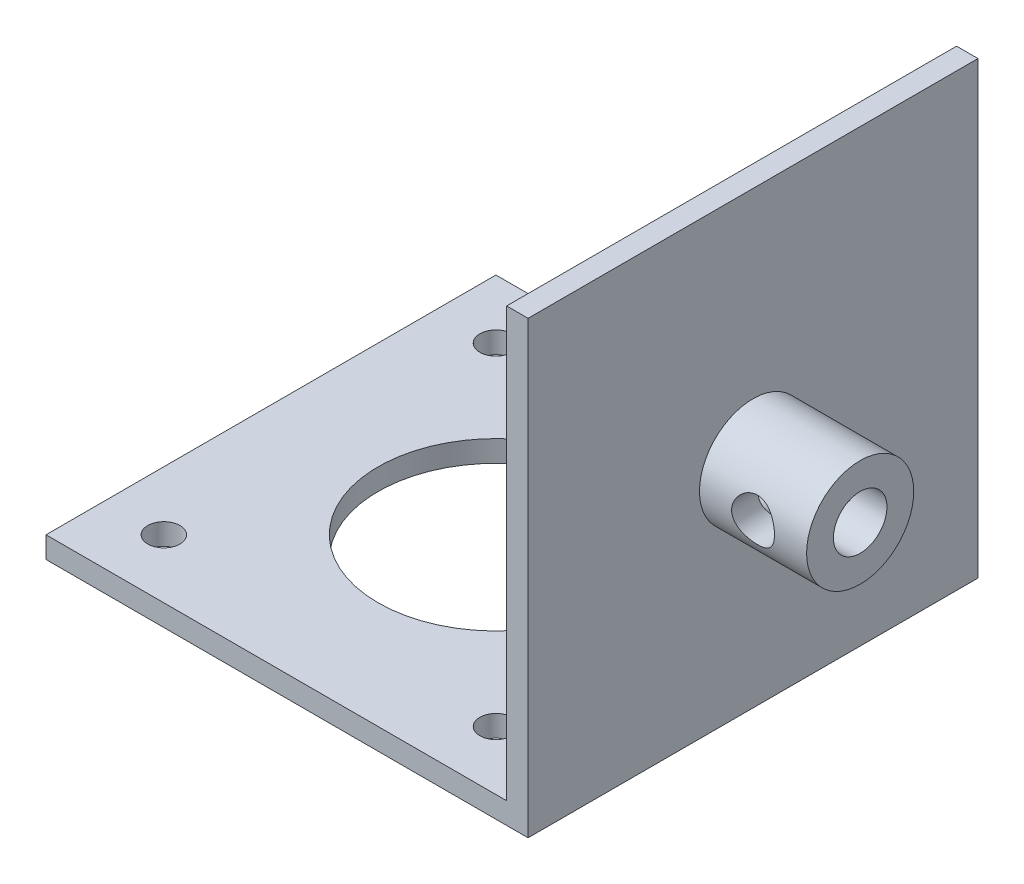
ISO-10303-21;
HEADER;
FILE_DESCRIPTION(('STEP AP214'),'2;1');
FILE_NAME('part.step','',(''),(''),'','','');
FILE_SCHEMA(('AUTOMOTIVE_DESIGN { 1 0 10303 214 1 1 1 1 }'));
ENDSEC;
DATA;
#1=APPLICATION_CONTEXT('core data for automotive mechanical design processes');
#2=APPLICATION_PROTOCOL_DEFINITION('international standard','automotive_design',2000,#1);
#3=PRODUCT_CONTEXT('',#1,'mechanical');
#4=PRODUCT('Part','Part','',(#3));
#5=PRODUCT_RELATED_PRODUCT_CATEGORY('part','',(#4));
#6=PRODUCT_DEFINITION_FORMATION('','',#4);
#7=PRODUCT_DEFINITION_CONTEXT('part definition',#1,'design');
#8=PRODUCT_DEFINITION('design','',#6,#7);
#9=PRODUCT_DEFINITION_SHAPE('','',#8);
#10=(LENGTH_UNIT() NAMED_UNIT(*) SI_UNIT(.MILLI.,.METRE.));
#11=(NAMED_UNIT(*) PLANE_ANGLE_UNIT() SI_UNIT($,.RADIAN.));
#12=(NAMED_UNIT(*) SI_UNIT($,.STERADIAN.) SOLID_ANGLE_UNIT());
#13=UNCERTAINTY_MEASURE_WITH_UNIT(LENGTH_MEASURE(1.E-05),#10,'distance_accuracy_value','');
#14=(GEOMETRIC_REPRESENTATION_CONTEXT(3) GLOBAL_UNCERTAINTY_ASSIGNED_CONTEXT((#13)) GLOBAL_UNIT_ASSIGNED_CONTEXT((#10,
#11,#12)) REPRESENTATION_CONTEXT('',''));
#15=CARTESIAN_POINT('',(0.,0.,0.));
#16=DIRECTION('',(0.,0.,1.));
#17=DIRECTION('',(1.,0.,0.));
#18=AXIS2_PLACEMENT_3D('',#15,#16,#17);
#19=CARTESIAN_POINT('',(0.,2.,0.));
#20=DIRECTION('',(0.,-1.,0.));
#21=DIRECTION('',(0.,0.,-1.));
#22=AXIS2_PLACEMENT_3D('',#19,#20,#21);
#23=PLANE('',#22);
#24=CARTESIAN_POINT('',(5.50000000000001,2.,-36.5));
#25=DIRECTION('',(0.,1.,0.));
#26=DIRECTION('',(0.,0.,1.));
#27=AXIS2_PLACEMENT_3D('',#24,#25,#26);
#28=CIRCLE('',#27,1.5);
#29=CARTESIAN_POINT('',(5.50000000000001,2.,-35.));
#30=VERTEX_POINT('',#29);
#31=EDGE_CURVE('E120',#30,#30,#28,.T.);
#32=ORIENTED_EDGE('',*,*,#31,.F.);
#33=EDGE_LOOP('',(#32));
#34=FACE_BOUND('',#33,.T.);
#35=CARTESIAN_POINT('',(21.,2.,-21.));
#36=DIRECTION('',(0.,1.,0.));
#37=DIRECTION('',(0.,0.,1.));
#38=AXIS2_PLACEMENT_3D('',#35,#36,#37);
#39=CIRCLE('',#38,11.);
#40=CARTESIAN_POINT('',(21.,2.,-10.));
#41=VERTEX_POINT('',#40);
#42=EDGE_CURVE('E257',#41,#41,#39,.T.);
#43=ORIENTED_EDGE('',*,*,#42,.F.);
#44=EDGE_LOOP('',(#43));
#45=FACE_BOUND('',#44,.T.);
#46=CARTESIAN_POINT('',(5.50000000000001,2.,-5.5));
#47=DIRECTION('',(0.,1.,0.));
#48=DIRECTION('',(0.,0.,1.));
#49=AXIS2_PLACEMENT_3D('',#46,#47,#48);
#50=CIRCLE('',#49,1.5);
#51=CARTESIAN_POINT('',(5.50000000000001,2.,-4.));
#52=VERTEX_POINT('',#51);
#53=EDGE_CURVE('E265',#52,#52,#50,.T.);
#54=ORIENTED_EDGE('',*,*,#53,.F.);
#55=EDGE_LOOP('',(#54));
#56=FACE_BOUND('',#55,.T.);
#57=CARTESIAN_POINT('',(36.5,2.,-5.5));
#58=DIRECTION('',(0.,1.,0.));
#59=DIRECTION('',(0.,0.,1.));
#60=AXIS2_PLACEMENT_3D('',#57,#58,#59);
#61=CIRCLE('',#60,1.5);
#62=CARTESIAN_POINT('',(36.5,2.,-4.));
#63=VERTEX_POINT('',#62);
#64=EDGE_CURVE('E273',#63,#63,#61,.T.);
#65=ORIENTED_EDGE('',*,*,#64,.F.);
#66=EDGE_LOOP('',(#65));
#67=FACE_BOUND('',#66,.T.);
#68=CARTESIAN_POINT('',(36.5,2.,-36.5));
#69=DIRECTION('',(0.,1.,0.));
#70=DIRECTION('',(0.,0.,1.));
#71=AXIS2_PLACEMENT_3D('',#68,#69,#70);
#72=CIRCLE('',#71,1.5);
#73=CARTESIAN_POINT('',(36.5,2.,-35.));
#74=VERTEX_POINT('',#73);
#75=EDGE_CURVE('E281',#74,#74,#72,.T.);
#76=ORIENTED_EDGE('',*,*,#75,.F.);
#77=EDGE_LOOP('',(#76));
#78=FACE_BOUND('',#77,.T.);
#79=DIRECTION('',(0.,0.,1.));
#80=VECTOR('',#79,1.);
#81=CARTESIAN_POINT('',(43.,2.,-42.));
#82=LINE('',#81,#80);
#83=CARTESIAN_POINT('',(43.,2.,-42.));
#84=VERTEX_POINT('',#83);
#85=CARTESIAN_POINT('',(43.,2.,0.));
#86=VERTEX_POINT('',#85);
#87=EDGE_CURVE('E64',#84,#86,#82,.T.);
#88=ORIENTED_EDGE('',*,*,#87,.F.);
#89=DIRECTION('',(-1.,0.,0.));
#90=VECTOR('',#89,1.);
#91=CARTESIAN_POINT('',(0.,2.,-42.));
#92=LINE('',#91,#90);
#93=CARTESIAN_POINT('',(0.,2.,-42.));
#94=VERTEX_POINT('',#93);
#95=EDGE_CURVE('E69',#84,#94,#92,.T.);
#96=ORIENTED_EDGE('',*,*,#95,.T.);
#97=DIRECTION('',(0.,0.,1.));
#98=VECTOR('',#97,1.);
#99=CARTESIAN_POINT('',(0.,2.,0.));
#100=LINE('',#99,#98);
#101=CARTESIAN_POINT('',(0.,2.,0.));
#102=VERTEX_POINT('',#101);
#103=EDGE_CURVE('E101',#94,#102,#100,.T.);
#104=ORIENTED_EDGE('',*,*,#103,.T.);
#105=DIRECTION('',(1.,0.,0.));
#106=VECTOR('',#105,1.);
#107=CARTESIAN_POINT('',(0.,2.,0.));
#108=LINE('',#107,#106);
#109=EDGE_CURVE('E292',#102,#86,#108,.T.);
#110=ORIENTED_EDGE('',*,*,#109,.T.);
#111=EDGE_LOOP('',(#88,#96,#104,#110));
#112=FACE_BOUND('',#111,.T.);
#113=ADVANCED_FACE('F41',(#34,#45,#56,#67,#78,#112),#23,.F.);
#114=CARTESIAN_POINT('',(0.,2.,0.));
#115=DIRECTION('',(1.,0.,0.));
#116=DIRECTION('',(0.,0.,-1.));
#117=AXIS2_PLACEMENT_3D('',#114,#115,#116);
#118=PLANE('',#117);
#119=DIRECTION('',(0.,0.,1.));
#120=VECTOR('',#119,1.);
#121=CARTESIAN_POINT('',(0.,0.,0.));
#122=LINE('',#121,#120);
#123=CARTESIAN_POINT('',(0.,0.,-42.));
#124=VERTEX_POINT('',#123);
#125=CARTESIAN_POINT('',(0.,0.,0.));
#126=VERTEX_POINT('',#125);
#127=EDGE_CURVE('E107',#124,#126,#122,.T.);
#128=ORIENTED_EDGE('',*,*,#127,.T.);
#129=DIRECTION('',(0.,-1.,0.));
#130=VECTOR('',#129,1.);
#131=CARTESIAN_POINT('',(0.,2.,0.));
#132=LINE('',#131,#130);
#133=EDGE_CURVE('E56',#102,#126,#132,.T.);
#134=ORIENTED_EDGE('',*,*,#133,.F.);
#135=ORIENTED_EDGE('',*,*,#103,.F.);
#136=DIRECTION('',(0.,-1.,0.));
#137=VECTOR('',#136,1.);
#138=CARTESIAN_POINT('',(0.,2.,-42.));
#139=LINE('',#138,#137);
#140=EDGE_CURVE('E92',#94,#124,#139,.T.);
#141=ORIENTED_EDGE('',*,*,#140,.T.);
#142=EDGE_LOOP('',(#128,#134,#135,#141));
#143=FACE_BOUND('',#142,.T.);
#144=ADVANCED_FACE('F43',(#143),#118,.F.);
#145=CARTESIAN_POINT('',(0.,2.,0.));
#146=DIRECTION('',(0.,0.,-1.));
#147=DIRECTION('',(-1.,0.,0.));
#148=AXIS2_PLACEMENT_3D('',#145,#146,#147);
#149=PLANE('',#148);
#150=DIRECTION('',(1.,0.,0.));
#151=VECTOR('',#150,1.);
#152=CARTESIAN_POINT('',(0.,0.,0.));
#153=LINE('',#152,#151);
#154=CARTESIAN_POINT('',(45.,0.,0.));
#155=VERTEX_POINT('',#154);
#156=EDGE_CURVE('E111',#126,#155,#153,.T.);
#157=ORIENTED_EDGE('',*,*,#156,.T.);
#158=DIRECTION('',(0.,-1.,0.));
#159=VECTOR('',#158,1.);
#160=CARTESIAN_POINT('',(45.,2.,0.));
#161=LINE('',#160,#159);
#162=CARTESIAN_POINT('',(45.,42.,0.));
#163=VERTEX_POINT('',#162);
#164=EDGE_CURVE('E129',#163,#155,#161,.T.);
#165=ORIENTED_EDGE('',*,*,#164,.F.);
#166=DIRECTION('',(1.,0.,0.));
#167=VECTOR('',#166,1.);
#168=CARTESIAN_POINT('',(43.,42.,0.));
#169=LINE('',#168,#167);
#170=CARTESIAN_POINT('',(43.,42.,0.));
#171=VERTEX_POINT('',#170);
#172=EDGE_CURVE('E245',#171,#163,#169,.T.);
#173=ORIENTED_EDGE('',*,*,#172,.F.);
#174=DIRECTION('',(0.,-1.,0.));
#175=VECTOR('',#174,1.);
#176=CARTESIAN_POINT('',(43.,42.,0.));
#177=LINE('',#176,#175);
#178=EDGE_CURVE('E247',#171,#86,#177,.T.);
#179=ORIENTED_EDGE('',*,*,#178,.T.);
#180=ORIENTED_EDGE('',*,*,#109,.F.);
#181=ORIENTED_EDGE('',*,*,#133,.T.);
#182=EDGE_LOOP('',(#157,#165,#173,#179,#180,#181));
#183=FACE_BOUND('',#182,.T.);
#184=ADVANCED_FACE('F210',(#183),#149,.F.);
#185=CARTESIAN_POINT('',(45.,2.,0.));
#186=DIRECTION('',(-1.,0.,0.));
#187=DIRECTION('',(0.,0.,1.));
#188=AXIS2_PLACEMENT_3D('',#185,#186,#187);
#189=PLANE('',#188);
#190=CARTESIAN_POINT('',(45.,20.,-21.));
#191=DIRECTION('',(-1.,0.,0.));
#192=DIRECTION('',(0.,0.,1.));
#193=AXIS2_PLACEMENT_3D('',#190,#191,#192);
#194=CIRCLE('',#193,5.);
#195=CARTESIAN_POINT('',(45.,20.,-16.));
#196=VERTEX_POINT('',#195);
#197=EDGE_CURVE('E11',#196,#196,#194,.F.);
#198=ORIENTED_EDGE('',*,*,#197,.F.);
#199=EDGE_LOOP('',(#198));
#200=FACE_BOUND('',#199,.T.);
#201=DIRECTION('',(0.,0.,-1.));
#202=VECTOR('',#201,1.);
#203=CARTESIAN_POINT('',(45.,0.,0.));
#204=LINE('',#203,#202);
#205=CARTESIAN_POINT('',(45.,0.,-42.));
#206=VERTEX_POINT('',#205);
#207=EDGE_CURVE('E102',#155,#206,#204,.T.);
#208=ORIENTED_EDGE('',*,*,#207,.T.);
#209=DIRECTION('',(0.,-1.,0.));
#210=VECTOR('',#209,1.);
#211=CARTESIAN_POINT('',(45.,2.,-42.));
#212=LINE('',#211,#210);
#213=CARTESIAN_POINT('',(45.,42.,-42.));
#214=VERTEX_POINT('',#213);
#215=EDGE_CURVE('E96',#214,#206,#212,.T.);
#216=ORIENTED_EDGE('',*,*,#215,.F.);
#217=DIRECTION('',(0.,0.,-1.));
#218=VECTOR('',#217,1.);
#219=CARTESIAN_POINT('',(45.,42.,0.));
#220=LINE('',#219,#218);
#221=EDGE_CURVE('E224',#163,#214,#220,.T.);
#222=ORIENTED_EDGE('',*,*,#221,.F.);
#223=ORIENTED_EDGE('',*,*,#164,.T.);
#224=EDGE_LOOP('',(#208,#216,#222,#223));
#225=FACE_BOUND('',#224,.T.);
#226=ADVANCED_FACE('F208',(#200,#225),#189,.F.);
#227=CARTESIAN_POINT('',(0.,2.,-42.));
#228=DIRECTION('',(0.,0.,1.));
#229=DIRECTION('',(1.,0.,0.));
#230=AXIS2_PLACEMENT_3D('',#227,#228,#229);
#231=PLANE('',#230);
#232=DIRECTION('',(-1.,0.,0.));
#233=VECTOR('',#232,1.);
#234=CARTESIAN_POINT('',(0.,0.,-42.));
#235=LINE('',#234,#233);
#236=EDGE_CURVE('E89',#206,#124,#235,.T.);
#237=ORIENTED_EDGE('',*,*,#236,.T.);
#238=ORIENTED_EDGE('',*,*,#140,.F.);
#239=ORIENTED_EDGE('',*,*,#95,.F.);
#240=DIRECTION('',(0.,-1.,0.));
#241=VECTOR('',#240,1.);
#242=CARTESIAN_POINT('',(43.,42.,-42.));
#243=LINE('',#242,#241);
#244=CARTESIAN_POINT('',(43.,42.,-42.));
#245=VERTEX_POINT('',#244);
#246=EDGE_CURVE('E252',#245,#84,#243,.T.);
#247=ORIENTED_EDGE('',*,*,#246,.F.);
#248=DIRECTION('',(-1.,0.,0.));
#249=VECTOR('',#248,1.);
#250=CARTESIAN_POINT('',(45.,42.,-42.));
#251=LINE('',#250,#249);
#252=EDGE_CURVE('E230',#214,#245,#251,.T.);
#253=ORIENTED_EDGE('',*,*,#252,.F.);
#254=ORIENTED_EDGE('',*,*,#215,.T.);
#255=EDGE_LOOP('',(#237,#238,#239,#247,#253,#254));
#256=FACE_BOUND('',#255,.T.);
#257=ADVANCED_FACE('F91',(#256),#231,.F.);
#258=CARTESIAN_POINT('',(0.,0.,0.));
#259=DIRECTION('',(0.,-1.,0.));
#260=DIRECTION('',(0.,0.,-1.));
#261=AXIS2_PLACEMENT_3D('',#258,#259,#260);
#262=PLANE('',#261);
#263=CARTESIAN_POINT('',(36.5,0.,-36.5));
#264=DIRECTION('',(0.,1.,0.));
#265=DIRECTION('',(0.,0.,1.));
#266=AXIS2_PLACEMENT_3D('',#263,#264,#265);
#267=CIRCLE('',#266,1.5);
#268=CARTESIAN_POINT('',(36.5,0.,-35.));
#269=VERTEX_POINT('',#268);
#270=EDGE_CURVE('E256',#269,#269,#267,.T.);
#271=ORIENTED_EDGE('',*,*,#270,.T.);
#272=EDGE_LOOP('',(#271));
#273=FACE_BOUND('',#272,.T.);
#274=CARTESIAN_POINT('',(36.5,0.,-5.5));
#275=DIRECTION('',(0.,1.,0.));
#276=DIRECTION('',(0.,0.,1.));
#277=AXIS2_PLACEMENT_3D('',#274,#275,#276);
#278=CIRCLE('',#277,1.5);
#279=CARTESIAN_POINT('',(36.5,0.,-4.));
#280=VERTEX_POINT('',#279);
#281=EDGE_CURVE('E277',#280,#280,#278,.T.);
#282=ORIENTED_EDGE('',*,*,#281,.T.);
#283=EDGE_LOOP('',(#282));
#284=FACE_BOUND('',#283,.T.);
#285=CARTESIAN_POINT('',(5.50000000000001,0.,-5.5));
#286=DIRECTION('',(0.,1.,0.));
#287=DIRECTION('',(0.,0.,1.));
#288=AXIS2_PLACEMENT_3D('',#285,#286,#287);
#289=CIRCLE('',#288,1.5);
#290=CARTESIAN_POINT('',(5.50000000000001,0.,-4.));
#291=VERTEX_POINT('',#290);
#292=EDGE_CURVE('E269',#291,#291,#289,.T.);
#293=ORIENTED_EDGE('',*,*,#292,.T.);
#294=EDGE_LOOP('',(#293));
#295=FACE_BOUND('',#294,.T.);
#296=CARTESIAN_POINT('',(21.,0.,-21.));
#297=DIRECTION('',(0.,1.,0.));
#298=DIRECTION('',(0.,0.,1.));
#299=AXIS2_PLACEMENT_3D('',#296,#297,#298);
#300=CIRCLE('',#299,11.);
#301=CARTESIAN_POINT('',(21.,0.,-10.));
#302=VERTEX_POINT('',#301);
#303=EDGE_CURVE('E261',#302,#302,#300,.T.);
#304=ORIENTED_EDGE('',*,*,#303,.T.);
#305=EDGE_LOOP('',(#304));
#306=FACE_BOUND('',#305,.T.);
#307=CARTESIAN_POINT('',(5.50000000000001,0.,-36.5));
#308=DIRECTION('',(0.,1.,0.));
#309=DIRECTION('',(0.,0.,1.));
#310=AXIS2_PLACEMENT_3D('',#307,#308,#309);
#311=CIRCLE('',#310,1.5);
#312=CARTESIAN_POINT('',(5.50000000000001,0.,-35.));
#313=VERTEX_POINT('',#312);
#314=EDGE_CURVE('E114',#313,#313,#311,.T.);
#315=ORIENTED_EDGE('',*,*,#314,.T.);
#316=EDGE_LOOP('',(#315));
#317=FACE_BOUND('',#316,.T.);
#318=ORIENTED_EDGE('',*,*,#127,.F.);
#319=ORIENTED_EDGE('',*,*,#236,.F.);
#320=ORIENTED_EDGE('',*,*,#207,.F.);
#321=ORIENTED_EDGE('',*,*,#156,.F.);
#322=EDGE_LOOP('',(#318,#319,#320,#321));
#323=FACE_BOUND('',#322,.T.);
#324=ADVANCED_FACE('F110',(#273,#284,#295,#306,#317,#323),#262,.T.);
#325=CARTESIAN_POINT('',(5.50000000000001,0.,-36.5));
#326=DIRECTION('',(0.,1.,0.));
#327=DIRECTION('',(0.,0.,1.));
#328=AXIS2_PLACEMENT_3D('',#325,#326,#327);
#329=CYLINDRICAL_SURFACE('',#328,1.5);
#330=ORIENTED_EDGE('',*,*,#314,.F.);
#331=EDGE_LOOP('',(#330));
#332=FACE_BOUND('',#331,.T.);
#333=ORIENTED_EDGE('',*,*,#31,.T.);
#334=EDGE_LOOP('',(#333));
#335=FACE_BOUND('',#334,.T.);
#336=ADVANCED_FACE('F185',(#332,#335),#329,.F.);
#337=CARTESIAN_POINT('',(21.,0.,-21.));
#338=DIRECTION('',(0.,1.,0.));
#339=DIRECTION('',(0.,0.,1.));
#340=AXIS2_PLACEMENT_3D('',#337,#338,#339);
#341=CYLINDRICAL_SURFACE('',#340,11.);
#342=ORIENTED_EDGE('',*,*,#303,.F.);
#343=EDGE_LOOP('',(#342));
#344=FACE_BOUND('',#343,.T.);
#345=ORIENTED_EDGE('',*,*,#42,.T.);
#346=EDGE_LOOP('',(#345));
#347=FACE_BOUND('',#346,.T.);
#348=ADVANCED_FACE('F181',(#344,#347),#341,.F.);
#349=CARTESIAN_POINT('',(5.50000000000001,0.,-5.5));
#350=DIRECTION('',(0.,1.,0.));
#351=DIRECTION('',(0.,0.,1.));
#352=AXIS2_PLACEMENT_3D('',#349,#350,#351);
#353=CYLINDRICAL_SURFACE('',#352,1.5);
#354=ORIENTED_EDGE('',*,*,#292,.F.);
#355=EDGE_LOOP('',(#354));
#356=FACE_BOUND('',#355,.T.);
#357=ORIENTED_EDGE('',*,*,#53,.T.);
#358=EDGE_LOOP('',(#357));
#359=FACE_BOUND('',#358,.T.);
#360=ADVANCED_FACE('F184',(#356,#359),#353,.F.);
#361=CARTESIAN_POINT('',(36.5,0.,-5.5));
#362=DIRECTION('',(0.,1.,0.));
#363=DIRECTION('',(0.,0.,1.));
#364=AXIS2_PLACEMENT_3D('',#361,#362,#363);
#365=CYLINDRICAL_SURFACE('',#364,1.5);
#366=ORIENTED_EDGE('',*,*,#281,.F.);
#367=EDGE_LOOP('',(#366));
#368=FACE_BOUND('',#367,.T.);
#369=ORIENTED_EDGE('',*,*,#64,.T.);
#370=EDGE_LOOP('',(#369));
#371=FACE_BOUND('',#370,.T.);
#372=ADVANCED_FACE('F189',(#368,#371),#365,.F.);
#373=CARTESIAN_POINT('',(36.5,0.,-36.5));
#374=DIRECTION('',(0.,1.,0.));
#375=DIRECTION('',(0.,0.,1.));
#376=AXIS2_PLACEMENT_3D('',#373,#374,#375);
#377=CYLINDRICAL_SURFACE('',#376,1.5);
#378=ORIENTED_EDGE('',*,*,#270,.F.);
#379=EDGE_LOOP('',(#378));
#380=FACE_BOUND('',#379,.T.);
#381=ORIENTED_EDGE('',*,*,#75,.T.);
#382=EDGE_LOOP('',(#381));
#383=FACE_BOUND('',#382,.T.);
#384=ADVANCED_FACE('F179',(#380,#383),#377,.F.);
#385=CARTESIAN_POINT('',(43.,42.,-42.));
#386=DIRECTION('',(1.,0.,0.));
#387=DIRECTION('',(0.,0.,-1.));
#388=AXIS2_PLACEMENT_3D('',#385,#386,#387);
#389=PLANE('',#388);
#390=ORIENTED_EDGE('',*,*,#87,.T.);
#391=ORIENTED_EDGE('',*,*,#178,.F.);
#392=DIRECTION('',(0.,0.,1.));
#393=VECTOR('',#392,1.);
#394=CARTESIAN_POINT('',(43.,42.,-42.));
#395=LINE('',#394,#393);
#396=EDGE_CURVE('E234',#245,#171,#395,.T.);
#397=ORIENTED_EDGE('',*,*,#396,.F.);
#398=ORIENTED_EDGE('',*,*,#246,.T.);
#399=EDGE_LOOP('',(#390,#391,#397,#398));
#400=FACE_BOUND('',#399,.T.);
#401=ADVANCED_FACE('F175',(#400),#389,.F.);
#402=CARTESIAN_POINT('',(0.,42.,0.));
#403=DIRECTION('',(0.,1.,0.));
#404=DIRECTION('',(0.,0.,1.));
#405=AXIS2_PLACEMENT_3D('',#402,#403,#404);
#406=PLANE('',#405);
#407=ORIENTED_EDGE('',*,*,#221,.T.);
#408=ORIENTED_EDGE('',*,*,#252,.T.);
#409=ORIENTED_EDGE('',*,*,#396,.T.);
#410=ORIENTED_EDGE('',*,*,#172,.T.);
#411=EDGE_LOOP('',(#407,#408,#409,#410));
#412=FACE_BOUND('',#411,.T.);
#413=ADVANCED_FACE('F170',(#412),#406,.T.);
#414=CARTESIAN_POINT('',(55.,20.,-21.));
#415=DIRECTION('',(-1.,0.,0.));
#416=DIRECTION('',(0.,0.,1.));
#417=AXIS2_PLACEMENT_3D('',#414,#415,#416);
#418=CYLINDRICAL_SURFACE('',#417,2.5);
#419=CARTESIAN_POINT('',(52.,20.,-18.5));
#420=CARTESIAN_POINT('',(51.9999924205671,19.9040031035611,-18.500007350526));
#421=CARTESIAN_POINT('',(51.9930305713364,19.8078668070353,-18.5055863158809));
#422=CARTESIAN_POINT('',(51.9656500599583,19.6186806345226,-18.527407306394));
#423=CARTESIAN_POINT('',(51.9452016287381,19.5256380656787,-18.5436729199962));
#424=CARTESIAN_POINT('',(51.8923217211049,19.3459050831755,-18.5853327818483));
#425=CARTESIAN_POINT('',(51.8599666485686,19.2591783018719,-18.6106687985583));
#426=CARTESIAN_POINT('',(51.7848826565227,19.0930736763075,-18.668639890034));
#427=CARTESIAN_POINT('',(51.7421537041494,19.0136958553285,-18.7012749879225));
#428=CARTESIAN_POINT('',(51.6313716349689,18.836818763433,-18.7842433527105));
#429=CARTESIAN_POINT('',(51.5596810848259,18.7426323204788,-18.8367825139678));
#430=CARTESIAN_POINT('',(51.4027219342605,18.5695863217212,-18.9470780739697));
#431=CARTESIAN_POINT('',(51.3174142464966,18.4907723846685,-19.004849277995));
#432=CARTESIAN_POINT('',(51.1332260159273,18.3478408104446,-19.1214399837017));
#433=CARTESIAN_POINT('',(51.0341532270239,18.2839736154278,-19.1802616909797));
#434=CARTESIAN_POINT('',(50.8234612174958,18.173531655864,-19.2911789011701));
#435=CARTESIAN_POINT('',(50.711885666112,18.126899006136,-19.3432965291083));
#436=CARTESIAN_POINT('',(50.526121048323,18.0691395622818,-19.4116434769907));
#437=CARTESIAN_POINT('',(50.4561882620197,18.0513452417934,-19.4337127222981));
#438=CARTESIAN_POINT('',(50.3127873158795,18.0232660320167,-19.4693011084417));
#439=CARTESIAN_POINT('',(50.239328326475,18.0129626811822,-19.4828412582026));
#440=CARTESIAN_POINT('',(50.0898074811289,18.0006015985745,-19.499157659389));
#441=CARTESIAN_POINT('',(50.0137285151792,17.9986165438658,-19.5018390307345));
#442=CARTESIAN_POINT('',(49.8622951079672,18.0033051830031,-19.4956003769719));
#443=CARTESIAN_POINT('',(49.7869413342337,18.0099862048891,-19.4866705333976));
#444=CARTESIAN_POINT('',(49.6277776973873,18.0330469728806,-19.4567927870003));
#445=CARTESIAN_POINT('',(49.544491993946,18.0507819179438,-19.4341815795047));
#446=CARTESIAN_POINT('',(49.3834644404629,18.0955545265115,-19.3800254006372));
#447=CARTESIAN_POINT('',(49.3057398434602,18.1226197435775,-19.3484540180136));
#448=CARTESIAN_POINT('',(49.119337893959,18.2002589780592,-19.2634388384058));
#449=CARTESIAN_POINT('',(49.0141973016958,18.255851134045,-19.2068662703185));
#450=CARTESIAN_POINT('',(48.8162833222006,18.3836153250246,-19.0908621993931));
#451=CARTESIAN_POINT('',(48.7235282791564,18.4558115309754,-19.0314266295106));
#452=CARTESIAN_POINT('',(48.5487252285949,18.618541816736,-18.9138724803155));
#453=CARTESIAN_POINT('',(48.4670280776942,18.7095129897303,-18.8558311073922));
#454=CARTESIAN_POINT('',(48.3199005005657,18.9080150892734,-18.7482812850501));
#455=CARTESIAN_POINT('',(48.2544264838827,19.0155003547989,-18.6987500817755));
#456=CARTESIAN_POINT('',(48.1594371525901,19.2122221856195,-18.6257541435668));
#457=CARTESIAN_POINT('',(48.1249954955609,19.2978222726708,-18.5988892877583));
#458=CARTESIAN_POINT('',(48.067873549012,19.4750860762629,-18.5540243588858));
#459=CARTESIAN_POINT('',(48.0451843950545,19.5667451637277,-18.5360176050309));
#460=CARTESIAN_POINT('',(48.0128614530642,19.7542867661551,-18.5102966431479));
#461=CARTESIAN_POINT('',(48.003295875255,19.8501886927874,-18.5026362136633));
#462=CARTESIAN_POINT('',(47.9981409510237,20.0426080028675,-18.4985131729814));
#463=CARTESIAN_POINT('',(48.0025490011779,20.139125268328,-18.5020484759094));
#464=CARTESIAN_POINT('',(48.0240828162477,20.3217466741555,-18.5192314135706));
#465=CARTESIAN_POINT('',(48.040149175139,20.4080608917566,-18.5320364759494));
#466=CARTESIAN_POINT('',(48.0828721811016,20.5763356742287,-18.5658248678653));
#467=CARTESIAN_POINT('',(48.1095319710966,20.658294938857,-18.5868106244656));
#468=CARTESIAN_POINT('',(48.1741503717839,20.8212358775489,-18.6371015056867));
#469=CARTESIAN_POINT('',(48.2127057859564,20.9018436194191,-18.6668408726313));
#470=CARTESIAN_POINT('',(48.2988621516328,21.0554100044833,-18.7321637727786));
#471=CARTESIAN_POINT('',(48.3464635542346,21.1283682659379,-18.7677475974158));
#472=CARTESIAN_POINT('',(48.4592243182969,21.2792523756915,-18.850063124776));
#473=CARTESIAN_POINT('',(48.526001690483,21.3555071897813,-18.8976303023178));
#474=CARTESIAN_POINT('',(48.669386961371,21.4965368759753,-18.9955650204798));
#475=CARTESIAN_POINT('',(48.7460228368388,21.5612777772737,-19.045940290089));
#476=CARTESIAN_POINT('',(48.8764344432366,21.6556848793079,-19.1262586468287));
#477=CARTESIAN_POINT('',(48.9273605907534,21.6891374179265,-19.1564525631454));
#478=CARTESIAN_POINT('',(49.0326222614236,21.7515500192055,-19.2156458447887));
#479=CARTESIAN_POINT('',(49.0869595718808,21.7805076986898,-19.2446445704811));
#480=CARTESIAN_POINT('',(49.1988748402817,21.8335808995982,-19.3001617120701));
#481=CARTESIAN_POINT('',(49.2564397672437,21.8577143168766,-19.3266890922517));
#482=CARTESIAN_POINT('',(49.375008978504,21.9008848195864,-19.3758979013231));
#483=CARTESIAN_POINT('',(49.4360107375196,21.9199255893155,-19.3985821061958));
#484=CARTESIAN_POINT('',(49.5660867242378,21.9536016588908,-19.4398057977742));
#485=CARTESIAN_POINT('',(49.6354226649404,21.96779559725,-19.4579028328523));
#486=CARTESIAN_POINT('',(49.7768376127381,21.9887890561937,-19.4850662840621));
#487=CARTESIAN_POINT('',(49.8489092204505,21.9956072307476,-19.4941554769248));
#488=CARTESIAN_POINT('',(49.9943487054641,22.0013205871655,-19.5017526322028));
#489=CARTESIAN_POINT('',(50.0677214541542,22.0001731977979,-19.5002037408156));
#490=CARTESIAN_POINT('',(50.2129841930231,21.989965195442,-19.4866922830401));
#491=CARTESIAN_POINT('',(50.2848716473261,21.9808920365379,-19.4747132065261));
#492=CARTESIAN_POINT('',(50.4446067743446,21.9520774575271,-19.4379292324392));
#493=CARTESIAN_POINT('',(50.5314230824911,21.9300923040864,-19.4105074158063));
#494=CARTESIAN_POINT('',(50.6986334786897,21.8760817721743,-19.3471109235759));
#495=CARTESIAN_POINT('',(50.7790077600367,21.8440268154256,-19.3111111278871));
#496=CARTESIAN_POINT('',(50.9121777220462,21.7809474631147,-19.2450884127556));
#497=CARTESIAN_POINT('',(50.9665191815183,21.7520236319041,-19.2161109267499));
#498=CARTESIAN_POINT('',(51.0718382298173,21.6896473378246,-19.15692051261));
#499=CARTESIAN_POINT('',(51.1228145849512,21.656193227659,-19.1267071378849));
#500=CARTESIAN_POINT('',(51.2707794032988,21.5491843557071,-19.0356200224188));
#501=CARTESIAN_POINT('',(51.3627986866625,21.4689854164051,-18.974301915186));
#502=CARTESIAN_POINT('',(51.5333894648308,21.2900171885843,-18.8558172121289));
#503=CARTESIAN_POINT('',(51.6117702242368,21.1910196615765,-18.798715080359));
#504=CARTESIAN_POINT('',(51.7155767294168,21.0299839989954,-18.7212534919547));
#505=CARTESIAN_POINT('',(51.7478684441351,20.9742554001997,-18.6968113189067));
#506=CARTESIAN_POINT('',(51.8073681009614,20.858854828628,-18.651338845344));
#507=CARTESIAN_POINT('',(51.8345791544845,20.7991852998053,-18.6303064577109));
#508=CARTESIAN_POINT('',(51.8917800598956,20.6550377394242,-18.585790944885));
#509=CARTESIAN_POINT('',(51.9194826718009,20.5691102395901,-18.5639710711237));
#510=CARTESIAN_POINT('',(51.9631576733877,20.3927130974277,-18.5294113502316));
#511=CARTESIAN_POINT('',(51.9791607887746,20.3022560241031,-18.5166477218313));
#512=CARTESIAN_POINT('',(51.9925630255603,20.1758809309199,-18.505946216909));
#513=CARTESIAN_POINT('',(51.9953473787458,20.1408085528212,-18.5037208123657));
#514=CARTESIAN_POINT('',(51.9990674635275,20.0704970748918,-18.500746189821));
#515=CARTESIAN_POINT('',(52.0000027837899,20.0352579397117,-18.4999973002835));
#516=CARTESIAN_POINT('',(52.,20.,-18.5));
#517=B_SPLINE_CURVE_WITH_KNOTS('',3,(#419,#420,#421,#422,#423,#424,#425,#426,#427,#428,#429,
#430,#431,#432,#433,#434,#435,#436,#437,#438,#439,#440,#441,#442,#443,#444,#445,#446,#447,#448,
#449,#450,#451,#452,#453,#454,#455,#456,#457,#458,#459,#460,#461,#462,#463,#464,#465,#466,#467,
#468,#469,#470,#471,#472,#473,#474,#475,#476,#477,#478,#479,#480,#481,#482,#483,#484,#485,#486,
#487,#488,#489,#490,#491,#492,#493,#494,#495,#496,#497,#498,#499,#500,#501,#502,#503,#504,#505,
#506,#507,#508,#509,#510,#511,#512,#513,#514,#515,#516),.UNSPECIFIED.,.T.,.F.,(4,2,2,2,2,2,2,2,
2,2,2,2,2,2,2,2,2,2,2,2,2,2,2,2,2,2,2,2,2,2,2,2,2,2,2,2,2,2,2,2,2,2,2,2,2,2,2,2,4),(0.,
0.287836605992206,0.576310692639344,0.862965057250607,1.14962032997081,1.53607888200101,
1.92366738187852,2.31734741765483,2.70969292925128,2.93534486341132,3.16043877408112,
3.38749528500762,3.61474392028825,3.87758630032013,4.14121163495708,4.53425748188304,
4.92787915886677,5.33198173288423,5.73498644040681,6.02213978124806,6.30907621738872,
6.59749843639968,6.88586692268775,7.15087004938163,7.41595185759576,7.69742753051569,
7.97891724351353,8.3136553724933,8.64936529970907,8.85316560745912,9.05707360380857,
9.26021055202084,9.46320013996587,9.68152133432602,9.89928907450689,10.1182215471168,
10.3375012031536,10.6169330531811,10.8971934831173,11.1010640012512,11.3050088506912,
11.7129165318149,12.1261363563907,12.332481104812,12.5386990694969,12.8161540735935,
13.0928777702217,13.1985714874517,13.3042887145431),.UNSPECIFIED.);
#518=CARTESIAN_POINT('',(52.,20.,-18.5));
#519=VERTEX_POINT('',#518);
#520=EDGE_CURVE('E161',#519,#519,#517,.T.);
#521=ORIENTED_EDGE('',*,*,#520,.F.);
#522=EDGE_LOOP('',(#521));
#523=FACE_BOUND('',#522,.T.);
#524=CARTESIAN_POINT('',(52.,20.,-23.5));
#525=CARTESIAN_POINT('',(51.9999924205671,20.0959968964389,-23.499992649474));
#526=CARTESIAN_POINT('',(51.9930305713364,20.1921331929647,-23.4944136841191));
#527=CARTESIAN_POINT('',(51.9656500599583,20.3813193654774,-23.472592693606));
#528=CARTESIAN_POINT('',(51.9452016287381,20.4743619343213,-23.4563270800038));
#529=CARTESIAN_POINT('',(51.8923217211049,20.6540949168245,-23.4146672181517));
#530=CARTESIAN_POINT('',(51.8599666485686,20.7408216981281,-23.3893312014417));
#531=CARTESIAN_POINT('',(51.7848826565227,20.9069263236925,-23.331360109966));
#532=CARTESIAN_POINT('',(51.7421537041494,20.9863041446715,-23.2987250120775));
#533=CARTESIAN_POINT('',(51.6313716349689,21.163181236567,-23.2157566472895));
#534=CARTESIAN_POINT('',(51.5596810848259,21.2573676795211,-23.1632174860322));
#535=CARTESIAN_POINT('',(51.4027219342605,21.4304136782788,-23.0529219260303));
#536=CARTESIAN_POINT('',(51.3174142464966,21.5092276153315,-22.9951507220051));
#537=CARTESIAN_POINT('',(51.1332260159273,21.6521591895554,-22.8785600162983));
#538=CARTESIAN_POINT('',(51.0341532270239,21.7160263845722,-22.8197383090203));
#539=CARTESIAN_POINT('',(50.8234612174958,21.826468344136,-22.7088210988299));
#540=CARTESIAN_POINT('',(50.711885666112,21.873100993864,-22.6567034708917));
#541=CARTESIAN_POINT('',(50.526121048323,21.9308604377182,-22.5883565230093));
#542=CARTESIAN_POINT('',(50.4561882620197,21.9486547582066,-22.5662872777019));
#543=CARTESIAN_POINT('',(50.3127873158795,21.9767339679833,-22.5306988915583));
#544=CARTESIAN_POINT('',(50.239328326475,21.9870373188178,-22.5171587417974));
#545=CARTESIAN_POINT('',(50.089807481129,21.9993984014255,-22.500842340611));
#546=CARTESIAN_POINT('',(50.0137285151792,22.0013834561342,-22.4981609692655));
#547=CARTESIAN_POINT('',(49.8622951079672,21.9966948169969,-22.5043996230281));
#548=CARTESIAN_POINT('',(49.7869413342337,21.9900137951109,-22.5133294666024));
#549=CARTESIAN_POINT('',(49.6277776973873,21.9669530271194,-22.5432072129997));
#550=CARTESIAN_POINT('',(49.544491993946,21.9492180820562,-22.5658184204953));
#551=CARTESIAN_POINT('',(49.383464440463,21.9044454734885,-22.6199745993628));
#552=CARTESIAN_POINT('',(49.3057398434602,21.8773802564225,-22.6515459819864));
#553=CARTESIAN_POINT('',(49.119337893959,21.7997410219408,-22.7365611615941));
#554=CARTESIAN_POINT('',(49.0141973016958,21.744148865955,-22.7931337296815));
#555=CARTESIAN_POINT('',(48.8162833222007,21.6163846749754,-22.9091378006069));
#556=CARTESIAN_POINT('',(48.7235282791565,21.5441884690246,-22.9685733704894));
#557=CARTESIAN_POINT('',(48.5487252285949,21.381458183264,-23.0861275196845));
#558=CARTESIAN_POINT('',(48.4670280776942,21.2904870102697,-23.1441688926078));
#559=CARTESIAN_POINT('',(48.3199005005657,21.0919849107267,-23.2517187149499));
#560=CARTESIAN_POINT('',(48.2544264838828,20.9844996452011,-23.3012499182245));
#561=CARTESIAN_POINT('',(48.1594371525901,20.7877778143806,-23.3742458564332));
#562=CARTESIAN_POINT('',(48.1249954955609,20.7021777273292,-23.4011107122417));
#563=CARTESIAN_POINT('',(48.067873549012,20.5249139237372,-23.4459756411142));
#564=CARTESIAN_POINT('',(48.0451843950545,20.4332548362723,-23.4639823949691));
#565=CARTESIAN_POINT('',(48.0128614530642,20.2457132338449,-23.4897033568521));
#566=CARTESIAN_POINT('',(48.003295875255,20.1498113072126,-23.4973637863367));
#567=CARTESIAN_POINT('',(47.9981409510237,19.9573919971325,-23.5014868270186));
#568=CARTESIAN_POINT('',(48.0025490011779,19.860874731672,-23.4979515240906));
#569=CARTESIAN_POINT('',(48.0240828162477,19.6782533258445,-23.4807685864295));
#570=CARTESIAN_POINT('',(48.040149175139,19.5919391082434,-23.4679635240506));
#571=CARTESIAN_POINT('',(48.0828721811015,19.4236643257713,-23.4341751321347));
#572=CARTESIAN_POINT('',(48.1095319710966,19.3417050611431,-23.4131893755344));
#573=CARTESIAN_POINT('',(48.1741503717839,19.1787641224511,-23.3628984943133));
#574=CARTESIAN_POINT('',(48.2127057859564,19.098156380581,-23.3331591273687));
#575=CARTESIAN_POINT('',(48.2988621516328,18.9445899955167,-23.2678362272214));
#576=CARTESIAN_POINT('',(48.3464635542345,18.8716317340621,-23.2322524025842));
#577=CARTESIAN_POINT('',(48.4592243182969,18.7207476243086,-23.149936875224));
#578=CARTESIAN_POINT('',(48.526001690483,18.6444928102187,-23.1023696976822));
#579=CARTESIAN_POINT('',(48.669386961371,18.5034631240247,-23.0044349795202));
#580=CARTESIAN_POINT('',(48.7460228368388,18.4387222227263,-22.954059709911));
#581=CARTESIAN_POINT('',(48.8764344432366,18.3443151206921,-22.8737413531714));
#582=CARTESIAN_POINT('',(48.9273605907533,18.3108625820735,-22.8435474368546));
#583=CARTESIAN_POINT('',(49.0326222614236,18.2484499807946,-22.7843541552113));
#584=CARTESIAN_POINT('',(49.0869595718808,18.2194923013102,-22.7553554295189));
#585=CARTESIAN_POINT('',(49.1988748402816,18.1664191004018,-22.69983828793));
#586=CARTESIAN_POINT('',(49.2564397672437,18.1422856831235,-22.6733109077483));
#587=CARTESIAN_POINT('',(49.375008978504,18.0991151804137,-22.6241020986769));
#588=CARTESIAN_POINT('',(49.4360107375195,18.0800744106845,-22.6014178938043));
#589=CARTESIAN_POINT('',(49.5660867242378,18.0463983411092,-22.5601942022258));
#590=CARTESIAN_POINT('',(49.6354226649403,18.03220440275,-22.5420971671477));
#591=CARTESIAN_POINT('',(49.776837612738,18.0112109438063,-22.5149337159379));
#592=CARTESIAN_POINT('',(49.8489092204505,18.0043927692524,-22.5058445230752));
#593=CARTESIAN_POINT('',(49.9943487054641,17.9986794128345,-22.4982473677972));
#594=CARTESIAN_POINT('',(50.0677214541541,17.9998268022021,-22.4997962591844));
#595=CARTESIAN_POINT('',(50.2129841930231,18.010034804558,-22.5133077169599));
#596=CARTESIAN_POINT('',(50.2848716473261,18.0191079634621,-22.5252867934739));
#597=CARTESIAN_POINT('',(50.4446067743445,18.0479225424728,-22.5620707675608));
#598=CARTESIAN_POINT('',(50.5314230824911,18.0699076959136,-22.5894925841937));
#599=CARTESIAN_POINT('',(50.6986334786896,18.1239182278257,-22.6528890764241));
#600=CARTESIAN_POINT('',(50.7790077600367,18.1559731845743,-22.6888888721129));
#601=CARTESIAN_POINT('',(50.9121777220461,18.2190525368853,-22.7549115872444));
#602=CARTESIAN_POINT('',(50.9665191815183,18.2479763680959,-22.7838890732501));
#603=CARTESIAN_POINT('',(51.0718382298172,18.3103526621754,-22.84307948739));
#604=CARTESIAN_POINT('',(51.1228145849511,18.343806772341,-22.8732928621151));
#605=CARTESIAN_POINT('',(51.2707794032988,18.4508156442929,-22.9643799775812));
#606=CARTESIAN_POINT('',(51.3627986866625,18.5310145835949,-23.025698084814));
#607=CARTESIAN_POINT('',(51.5333894648307,18.7099828114157,-23.1441827878711));
#608=CARTESIAN_POINT('',(51.6117702242368,18.8089803384235,-23.201284919641));
#609=CARTESIAN_POINT('',(51.7155767294168,18.9700160010045,-23.2787465080453));
#610=CARTESIAN_POINT('',(51.7478684441351,19.0257445998003,-23.3031886810933));
#611=CARTESIAN_POINT('',(51.8073681009614,19.1411451713719,-23.348661154656));
#612=CARTESIAN_POINT('',(51.8345791544845,19.2008147001946,-23.3696935422891));
#613=CARTESIAN_POINT('',(51.8917800598956,19.3449622605757,-23.414209055115));
#614=CARTESIAN_POINT('',(51.9194826718009,19.4308897604099,-23.4360289288763));
#615=CARTESIAN_POINT('',(51.9631576733877,19.6072869025723,-23.4705886497684));
#616=CARTESIAN_POINT('',(51.9791607887746,19.6977439758968,-23.4833522781687));
#617=CARTESIAN_POINT('',(51.9925630255603,19.8241190690801,-23.494053783091));
#618=CARTESIAN_POINT('',(51.9953473787458,19.8591914471787,-23.4962791876343));
#619=CARTESIAN_POINT('',(51.9990674635275,19.9295029251082,-23.499253810179));
#620=CARTESIAN_POINT('',(52.0000027837899,19.9647420602883,-23.5000026997165));
#621=CARTESIAN_POINT('',(52.,20.,-23.5));
#622=B_SPLINE_CURVE_WITH_KNOTS('',3,(#524,#525,#526,#527,#528,#529,#530,#531,#532,#533,#534,
#535,#536,#537,#538,#539,#540,#541,#542,#543,#544,#545,#546,#547,#548,#549,#550,#551,#552,#553,
#554,#555,#556,#557,#558,#559,#560,#561,#562,#563,#564,#565,#566,#567,#568,#569,#570,#571,#572,
#573,#574,#575,#576,#577,#578,#579,#580,#581,#582,#583,#584,#585,#586,#587,#588,#589,#590,#591,
#592,#593,#594,#595,#596,#597,#598,#599,#600,#601,#602,#603,#604,#605,#606,#607,#608,#609,#610,
#611,#612,#613,#614,#615,#616,#617,#618,#619,#620,#621),.UNSPECIFIED.,.T.,.F.,(4,2,2,2,2,2,2,2,
2,2,2,2,2,2,2,2,2,2,2,2,2,2,2,2,2,2,2,2,2,2,2,2,2,2,2,2,2,2,2,2,2,2,2,2,2,2,2,2,4),(0.,
0.287836605992206,0.576310692639344,0.862965057250607,1.14962032997081,1.536078882001,
1.92366738187851,2.31734741765482,2.70969292925127,2.9353448634113,3.16043877408111,
3.38749528500761,3.61474392028823,3.8775863003201,4.14121163495705,4.53425748188301,
4.92787915886675,5.33198173288421,5.73498644040677,6.02213978124803,6.30907621738869,
6.59749843639965,6.88586692268772,7.15087004938159,7.41595185759573,7.69742753051567,
7.97891724351351,8.31365537249326,8.64936529970903,8.85316560745908,9.05707360380852,
9.26021055202079,9.46320013996582,9.68152133432597,9.89928907450685,10.1182215471168,
10.3375012031536,10.616933053181,10.8971934831173,11.1010640012511,11.3050088506911,
11.7129165318148,12.1261363563906,12.3324811048119,12.5386990694968,12.8161540735935,
13.0928777702216,13.1985714874517,13.3042887145431),.UNSPECIFIED.);
#623=CARTESIAN_POINT('',(52.,20.,-23.5));
#624=VERTEX_POINT('',#623);
#625=EDGE_CURVE('E155',#624,#624,#622,.T.);
#626=ORIENTED_EDGE('',*,*,#625,.F.);
#627=EDGE_LOOP('',(#626));
#628=FACE_BOUND('',#627,.T.);
#629=CARTESIAN_POINT('',(55.,20.,-21.));
#630=DIRECTION('',(1.,0.,0.));
#631=DIRECTION('',(0.,0.,-1.));
#632=AXIS2_PLACEMENT_3D('',#629,#630,#631);
#633=CIRCLE('',#632,2.5);
#634=CARTESIAN_POINT('',(55.,20.,-23.5));
#635=VERTEX_POINT('',#634);
#636=EDGE_CURVE('E328',#635,#635,#633,.T.);
#637=ORIENTED_EDGE('',*,*,#636,.T.);
#638=EDGE_LOOP('',(#637));
#639=FACE_BOUND('',#638,.T.);
#640=CARTESIAN_POINT('',(45.,20.,-21.));
#641=DIRECTION('',(1.,0.,0.));
#642=DIRECTION('',(0.,0.,-1.));
#643=AXIS2_PLACEMENT_3D('',#640,#641,#642);
#644=CIRCLE('',#643,2.5);
#645=CARTESIAN_POINT('',(45.,20.,-23.5));
#646=VERTEX_POINT('',#645);
#647=EDGE_CURVE('E239',#646,#646,#644,.T.);
#648=ORIENTED_EDGE('',*,*,#647,.F.);
#649=EDGE_LOOP('',(#648));
#650=FACE_BOUND('',#649,.T.);
#651=ADVANCED_FACE('F166',(#523,#628,#639,#650),#418,.F.);
#652=CARTESIAN_POINT('',(55.,20.,-21.));
#653=DIRECTION('',(-1.,0.,0.));
#654=DIRECTION('',(0.,0.,1.));
#655=AXIS2_PLACEMENT_3D('',#652,#653,#654);
#656=CYLINDRICAL_SURFACE('',#655,5.);
#657=CARTESIAN_POINT('',(52.,20.,-16.));
#658=CARTESIAN_POINT('',(51.9999901481763,19.8925069945571,-16.0000072877292));
#659=CARTESIAN_POINT('',(51.9912822479116,19.7848274359093,-16.0035070569307));
#660=CARTESIAN_POINT('',(51.9567522964788,19.5725035195821,-16.0171654689936));
#661=CARTESIAN_POINT('',(51.9308837209139,19.4678682224387,-16.0273422130112));
#662=CARTESIAN_POINT('',(51.8631239219412,19.2650460772726,-16.0532579078688));
#663=CARTESIAN_POINT('',(51.8212851537833,19.166839338383,-16.0689786363593));
#664=CARTESIAN_POINT('',(51.7229808266735,18.9789280296716,-16.1044338920392));
#665=CARTESIAN_POINT('',(51.6665203450811,18.889220523249,-16.1241670254194));
#666=CARTESIAN_POINT('',(51.5377645014391,18.7164989924296,-16.1666911382958));
#667=CARTESIAN_POINT('',(51.4648933437597,18.6339377274498,-16.1895770307081));
#668=CARTESIAN_POINT('',(51.3065999965232,18.4818249952153,-16.2353942309381));
#669=CARTESIAN_POINT('',(51.2211717027883,18.4122798928665,-16.2583255554621));
#670=CARTESIAN_POINT('',(51.0355719297577,18.2851254327071,-16.3027720820286));
#671=CARTESIAN_POINT('',(50.9349135139768,18.2281850188045,-16.3241788403505));
#672=CARTESIAN_POINT('',(50.72446360158,18.1322452809628,-16.3616635281321));
#673=CARTESIAN_POINT('',(50.6146764721516,18.0932374357142,-16.3777439875582));
#674=CARTESIAN_POINT('',(50.3942876664079,18.0361011766041,-16.4017364233918));
#675=CARTESIAN_POINT('',(50.2839487644238,18.0171060341943,-16.409985796444));
#676=CARTESIAN_POINT('',(50.0613650016927,17.99782703836,-16.4183599595086));
#677=CARTESIAN_POINT('',(49.949121105375,17.9975339836868,-16.4184887447723));
#678=CARTESIAN_POINT('',(49.734243328542,18.0150106324955,-16.4108949972001));
#679=CARTESIAN_POINT('',(49.631484285591,18.0315246856949,-16.4037182496155));
#680=CARTESIAN_POINT('',(49.4303404439933,18.0800531197022,-16.3832381239216));
#681=CARTESIAN_POINT('',(49.3319564118897,18.1120702051954,-16.3699336767833));
#682=CARTESIAN_POINT('',(49.139982163804,18.1913052674489,-16.3384051491147));
#683=CARTESIAN_POINT('',(49.0465307609453,18.2388201376847,-16.3200862071921));
#684=CARTESIAN_POINT('',(48.8685841836384,18.3474935392678,-16.2806188361011));
#685=CARTESIAN_POINT('',(48.7840923905972,18.4086571948991,-16.2594693454315));
#686=CARTESIAN_POINT('',(48.619590271198,18.5484494005456,-16.2147326325773));
#687=CARTESIAN_POINT('',(48.540431270554,18.6280625370294,-16.1910833502385));
#688=CARTESIAN_POINT('',(48.396315521998,18.7996855725698,-16.1454017504172));
#689=CARTESIAN_POINT('',(48.3313616025897,18.8916979346656,-16.1233697555468));
#690=CARTESIAN_POINT('',(48.2163825525842,19.0879223473942,-16.0828531873545));
#691=CARTESIAN_POINT('',(48.1666777188029,19.1923395086535,-16.0644472990459));
#692=CARTESIAN_POINT('',(48.0858321389219,19.4089762345171,-16.0338517167124));
#693=CARTESIAN_POINT('',(48.0546819624426,19.5211918031503,-16.0216588653762));
#694=CARTESIAN_POINT('',(48.0135517045803,19.7431041123922,-16.0054386049309));
#695=CARTESIAN_POINT('',(48.0024275457464,19.8525567060145,-16.0009705416649));
#696=CARTESIAN_POINT('',(47.9982868994714,20.0718453098078,-15.9993152148937));
#697=CARTESIAN_POINT('',(48.0052657184525,20.1816812132239,-16.0021260641771));
#698=CARTESIAN_POINT('',(48.036291752552,20.393432739122,-16.0144243293625));
#699=CARTESIAN_POINT('',(48.059557980351,20.4954824917755,-16.0236060865448));
#700=CARTESIAN_POINT('',(48.1214357083098,20.6941354280608,-16.047405585945));
#701=CARTESIAN_POINT('',(48.1600491796687,20.7907379102248,-16.0620240264347));
#702=CARTESIAN_POINT('',(48.2527849396799,20.9790787858167,-16.0958340522919));
#703=CARTESIAN_POINT('',(48.3073454720431,21.0705780227554,-16.115151840202));
#704=CARTESIAN_POINT('',(48.4299403239056,21.2434435912466,-16.1562663525448));
#705=CARTESIAN_POINT('',(48.4979800429226,21.3248058407611,-16.1780640688973));
#706=CARTESIAN_POINT('',(48.6508700129496,21.4807230430288,-16.2235488236189));
#707=CARTESIAN_POINT('',(48.7365335415062,21.5544739338061,-16.2472655857495));
#708=CARTESIAN_POINT('',(48.9194400830094,21.6867511974137,-16.2925832708287));
#709=CARTESIAN_POINT('',(49.0166850003399,21.7452750613375,-16.3141838447349));
#710=CARTESIAN_POINT('',(49.2214616945941,21.8458075019316,-16.3528570009229));
#711=CARTESIAN_POINT('',(49.3290839992123,21.8876505945345,-16.3698836911521));
#712=CARTESIAN_POINT('',(49.5507336517152,21.9522962197053,-16.3967632652207));
#713=CARTESIAN_POINT('',(49.6647562058124,21.9751128052693,-16.40662144304));
#714=CARTESIAN_POINT('',(49.8871279017745,21.9997156172784,-16.4172824070007));
#715=CARTESIAN_POINT('',(49.9952948395933,22.0028970823029,-16.4186857899183));
#716=CARTESIAN_POINT('',(50.2105448577133,21.9918031592775,-16.413851639669));
#717=CARTESIAN_POINT('',(50.3176280739026,21.9775299879138,-16.4076150767521));
#718=CARTESIAN_POINT('',(50.523332189855,21.9330713661537,-16.3887335092098));
#719=CARTESIAN_POINT('',(50.622120274433,21.903537493571,-16.3763516817255));
#720=CARTESIAN_POINT('',(50.8133786296135,21.830005448491,-16.346759987673));
#721=CARTESIAN_POINT('',(50.9058471468998,21.7860032813938,-16.3295487879399));
#722=CARTESIAN_POINT('',(51.0876096192708,21.6818727627597,-16.2910139039551));
#723=CARTESIAN_POINT('',(51.1764186701305,21.6209653351595,-16.2695111768676));
#724=CARTESIAN_POINT('',(51.3429933172037,21.4858921192715,-16.2253619562776));
#725=CARTESIAN_POINT('',(51.4207555721283,21.4117223348181,-16.2027151195159));
#726=CARTESIAN_POINT('',(51.5682028532636,21.2465055062725,-16.1570643291261));
#727=CARTESIAN_POINT('',(51.6370373068981,21.1546760011461,-16.1341324203782));
#728=CARTESIAN_POINT('',(51.7583370426216,20.9599003202858,-16.0919959328628));
#729=CARTESIAN_POINT('',(51.8107947121525,20.8569490045472,-16.0727930890709));
#730=CARTESIAN_POINT('',(51.8966222151903,20.6447380624952,-16.0406028518414));
#731=CARTESIAN_POINT('',(51.9303293235603,20.5356316182197,-16.0275063694497));
#732=CARTESIAN_POINT('',(51.9786391209543,20.3128765462812,-16.0085569379063));
#733=CARTESIAN_POINT('',(51.9933024367439,20.1992435258589,-16.0026810050436));
#734=CARTESIAN_POINT('',(51.9993953809783,20.0569122978909,-16.0002410049586));
#735=CARTESIAN_POINT('',(52.0000026086292,20.0284626887408,-15.9999980703082));
#736=CARTESIAN_POINT('',(52.,20.,-16.));
#737=B_SPLINE_CURVE_WITH_KNOTS('',3,(#657,#658,#659,#660,#661,#662,#663,#664,#665,#666,#667,
#668,#669,#670,#671,#672,#673,#674,#675,#676,#677,#678,#679,#680,#681,#682,#683,#684,#685,#686,
#687,#688,#689,#690,#691,#692,#693,#694,#695,#696,#697,#698,#699,#700,#701,#702,#703,#704,#705,
#706,#707,#708,#709,#710,#711,#712,#713,#714,#715,#716,#717,#718,#719,#720,#721,#722,#723,#724,
#725,#726,#727,#728,#729,#730,#731,#732,#733,#734,#735,#736),.UNSPECIFIED.,.T.,.F.,(4,2,2,2,2,2,
2,2,2,2,2,2,2,2,2,2,2,2,2,2,2,2,2,2,2,2,2,2,2,2,2,2,2,2,2,2,2,2,2,4),(0.,0.32240298789307,
0.645683636007937,0.967911457471579,1.29002753567985,1.62597381700398,1.96208394934412,
2.31315258819217,2.66405423118268,2.99904105308829,3.33386306340489,3.64538328401373,
3.95695787256048,4.27489126298816,4.59294421938184,4.93558349186558,5.27829092839734,
5.62776913162807,5.97706956113791,6.30569184528008,6.63422893570083,6.94800455564367,
7.26182048993798,7.58523513398264,7.9087795949897,8.25368474624415,8.5986466904375,
8.9469504514083,9.29499672645935,9.61799673392749,9.94095572563047,10.2511431854877,
10.5614163580516,10.8894546805669,11.2175920134839,11.5670042353384,11.9165786364053,
12.2596430101332,12.6016125240434,12.686980458968),.UNSPECIFIED.);
#738=CARTESIAN_POINT('',(52.,20.,-16.));
#739=VERTEX_POINT('',#738);
#740=EDGE_CURVE('E45',#739,#739,#737,.T.);
#741=ORIENTED_EDGE('',*,*,#740,.T.);
#742=EDGE_LOOP('',(#741));
#743=FACE_BOUND('',#742,.T.);
#744=CARTESIAN_POINT('',(52.,20.,-26.));
#745=CARTESIAN_POINT('',(51.9999901481763,20.1074930054429,-25.9999927122709));
#746=CARTESIAN_POINT('',(51.9912822479116,20.2151725640907,-25.9964929430693));
#747=CARTESIAN_POINT('',(51.9567522964788,20.4274964804179,-25.9828345310064));
#748=CARTESIAN_POINT('',(51.9308837209139,20.5321317775612,-25.9726577869888));
#749=CARTESIAN_POINT('',(51.8631239219412,20.7349539227274,-25.9467420921312));
#750=CARTESIAN_POINT('',(51.8212851537833,20.833160661617,-25.9310213636407));
#751=CARTESIAN_POINT('',(51.7229808266735,21.0210719703284,-25.8955661079608));
#752=CARTESIAN_POINT('',(51.6665203450811,21.110779476751,-25.8758329745806));
#753=CARTESIAN_POINT('',(51.5377645014391,21.2835010075704,-25.8333088617042));
#754=CARTESIAN_POINT('',(51.4648933437597,21.3660622725502,-25.8104229692919));
#755=CARTESIAN_POINT('',(51.3065999965232,21.5181750047847,-25.7646057690619));
#756=CARTESIAN_POINT('',(51.2211717027883,21.5877201071335,-25.7416744445379));
#757=CARTESIAN_POINT('',(51.0355719297577,21.7148745672929,-25.6972279179714));
#758=CARTESIAN_POINT('',(50.9349135139768,21.7718149811955,-25.6758211596495));
#759=CARTESIAN_POINT('',(50.72446360158,21.8677547190371,-25.6383364718679));
#760=CARTESIAN_POINT('',(50.6146764721516,21.9067625642858,-25.6222560124418));
#761=CARTESIAN_POINT('',(50.3942876664079,21.9638988233959,-25.5982635766082));
#762=CARTESIAN_POINT('',(50.2839487644238,21.9828939658057,-25.5900142035561));
#763=CARTESIAN_POINT('',(50.0613650016927,22.00217296164,-25.5816400404914));
#764=CARTESIAN_POINT('',(49.949121105375,22.0024660163132,-25.5815112552277));
#765=CARTESIAN_POINT('',(49.734243328542,21.9849893675045,-25.5891050027999));
#766=CARTESIAN_POINT('',(49.631484285591,21.9684753143051,-25.5962817503845));
#767=CARTESIAN_POINT('',(49.4303404439933,21.9199468802978,-25.6167618760784));
#768=CARTESIAN_POINT('',(49.3319564118897,21.8879297948046,-25.6300663232167));
#769=CARTESIAN_POINT('',(49.139982163804,21.8086947325511,-25.6615948508853));
#770=CARTESIAN_POINT('',(49.0465307609453,21.7611798623153,-25.6799137928079));
#771=CARTESIAN_POINT('',(48.8685841836384,21.6525064607322,-25.7193811638989));
#772=CARTESIAN_POINT('',(48.7840923905972,21.5913428051009,-25.7405306545685));
#773=CARTESIAN_POINT('',(48.619590271198,21.4515505994544,-25.7852673674227));
#774=CARTESIAN_POINT('',(48.540431270554,21.3719374629706,-25.8089166497615));
#775=CARTESIAN_POINT('',(48.396315521998,21.2003144274302,-25.8545982495828));
#776=CARTESIAN_POINT('',(48.3313616025897,21.1083020653344,-25.8766302444532));
#777=CARTESIAN_POINT('',(48.2163825525842,20.9120776526058,-25.9171468126455));
#778=CARTESIAN_POINT('',(48.1666777188029,20.8076604913465,-25.9355527009542));
#779=CARTESIAN_POINT('',(48.0858321389219,20.5910237654829,-25.9661482832876));
#780=CARTESIAN_POINT('',(48.0546819624426,20.4788081968497,-25.9783411346238));
#781=CARTESIAN_POINT('',(48.0135517045803,20.2568958876078,-25.9945613950691));
#782=CARTESIAN_POINT('',(48.0024275457464,20.1474432939855,-25.9990294583351));
#783=CARTESIAN_POINT('',(47.9982868994714,19.9281546901922,-26.0006847851063));
#784=CARTESIAN_POINT('',(48.0052657184525,19.8183187867761,-25.9978739358229));
#785=CARTESIAN_POINT('',(48.036291752552,19.606567260878,-25.9855756706375));
#786=CARTESIAN_POINT('',(48.059557980351,19.5045175082245,-25.9763939134552));
#787=CARTESIAN_POINT('',(48.1214357083098,19.3058645719392,-25.952594414055));
#788=CARTESIAN_POINT('',(48.1600491796687,19.2092620897752,-25.9379759735653));
#789=CARTESIAN_POINT('',(48.2527849396799,19.0209212141833,-25.9041659477081));
#790=CARTESIAN_POINT('',(48.3073454720431,18.9294219772446,-25.884848159798));
#791=CARTESIAN_POINT('',(48.4299403239056,18.7565564087534,-25.8437336474552));
#792=CARTESIAN_POINT('',(48.4979800429226,18.6751941592389,-25.8219359311027));
#793=CARTESIAN_POINT('',(48.6508700129496,18.5192769569712,-25.7764511763811));
#794=CARTESIAN_POINT('',(48.7365335415062,18.4455260661939,-25.7527344142505));
#795=CARTESIAN_POINT('',(48.9194400830094,18.3132488025863,-25.7074167291713));
#796=CARTESIAN_POINT('',(49.0166850003399,18.2547249386625,-25.6858161552651));
#797=CARTESIAN_POINT('',(49.2214616945941,18.1541924980684,-25.6471429990771));
#798=CARTESIAN_POINT('',(49.3290839992123,18.1123494054655,-25.6301163088479));
#799=CARTESIAN_POINT('',(49.5507336517152,18.0477037802947,-25.6032367347793));
#800=CARTESIAN_POINT('',(49.6647562058124,18.0248871947307,-25.59337855696));
#801=CARTESIAN_POINT('',(49.8871279017745,18.0002843827216,-25.5827175929993));
#802=CARTESIAN_POINT('',(49.9952948395933,17.9971029176971,-25.5813142100817));
#803=CARTESIAN_POINT('',(50.2105448577133,18.0081968407225,-25.586148360331));
#804=CARTESIAN_POINT('',(50.3176280739026,18.0224700120862,-25.5923849232479));
#805=CARTESIAN_POINT('',(50.523332189855,18.0669286338463,-25.6112664907902));
#806=CARTESIAN_POINT('',(50.622120274433,18.096462506429,-25.6236483182745));
#807=CARTESIAN_POINT('',(50.8133786296135,18.169994551509,-25.653240012327));
#808=CARTESIAN_POINT('',(50.9058471468998,18.2139967186062,-25.6704512120601));
#809=CARTESIAN_POINT('',(51.0876096192708,18.3181272372403,-25.7089860960449));
#810=CARTESIAN_POINT('',(51.1764186701305,18.3790346648405,-25.7304888231324));
#811=CARTESIAN_POINT('',(51.3429933172037,18.5141078807285,-25.7746380437224));
#812=CARTESIAN_POINT('',(51.4207555721283,18.5882776651819,-25.7972848804841));
#813=CARTESIAN_POINT('',(51.5682028532636,18.7534944937275,-25.8429356708739));
#814=CARTESIAN_POINT('',(51.6370373068981,18.8453239988539,-25.8658675796219));
#815=CARTESIAN_POINT('',(51.7583370426216,19.0400996797142,-25.9080040671372));
#816=CARTESIAN_POINT('',(51.8107947121525,19.1430509954528,-25.9272069109291));
#817=CARTESIAN_POINT('',(51.8966222151903,19.3552619375048,-25.9593971481586));
#818=CARTESIAN_POINT('',(51.9303293235603,19.4643683817803,-25.9724936305503));
#819=CARTESIAN_POINT('',(51.9786391209543,19.6871234537188,-25.9914430620937));
#820=CARTESIAN_POINT('',(51.9933024367439,19.8007564741411,-25.9973189949564));
#821=CARTESIAN_POINT('',(51.9993953809783,19.9430877021091,-25.9997589950414));
#822=CARTESIAN_POINT('',(52.0000026086292,19.9715373112592,-26.0000019296918));
#823=CARTESIAN_POINT('',(52.,20.,-26.));
#824=B_SPLINE_CURVE_WITH_KNOTS('',3,(#744,#745,#746,#747,#748,#749,#750,#751,#752,#753,#754,
#755,#756,#757,#758,#759,#760,#761,#762,#763,#764,#765,#766,#767,#768,#769,#770,#771,#772,#773,
#774,#775,#776,#777,#778,#779,#780,#781,#782,#783,#784,#785,#786,#787,#788,#789,#790,#791,#792,
#793,#794,#795,#796,#797,#798,#799,#800,#801,#802,#803,#804,#805,#806,#807,#808,#809,#810,#811,
#812,#813,#814,#815,#816,#817,#818,#819,#820,#821,#822,#823),.UNSPECIFIED.,.T.,.F.,(4,2,2,2,2,2,
2,2,2,2,2,2,2,2,2,2,2,2,2,2,2,2,2,2,2,2,2,2,2,2,2,2,2,2,2,2,2,2,2,4),(0.,0.32240298789307,
0.645683636007934,0.967911457471583,1.29002753567984,1.62597381700397,1.96208394934411,
2.31315258819217,2.66405423118267,2.99904105308828,3.33386306340488,3.64538328401372,
3.95695787256048,4.27489126298816,4.59294421938184,4.93558349186558,5.27829092839734,
5.62776913162807,5.97706956113791,6.30569184528008,6.63422893570083,6.94800455564366,
7.26182048993797,7.58523513398263,7.9087795949897,8.25368474624415,8.59864669043749,
8.9469504514083,9.29499672645934,9.61799673392749,9.94095572563047,10.2511431854877,
10.5614163580516,10.8894546805669,11.2175920134839,11.5670042353384,11.9165786364053,
12.2596430101332,12.6016125240434,12.686980458968),.UNSPECIFIED.);
#825=CARTESIAN_POINT('',(52.,20.,-26.));
#826=VERTEX_POINT('',#825);
#827=EDGE_CURVE('E134',#826,#826,#824,.T.);
#828=ORIENTED_EDGE('',*,*,#827,.T.);
#829=EDGE_LOOP('',(#828));
#830=FACE_BOUND('',#829,.T.);
#831=CARTESIAN_POINT('',(55.,20.,-21.));
#832=DIRECTION('',(1.,0.,0.));
#833=DIRECTION('',(0.,0.,-1.));
#834=AXIS2_PLACEMENT_3D('',#831,#832,#833);
#835=CIRCLE('',#834,5.);
#836=CARTESIAN_POINT('',(55.,20.,-26.));
#837=VERTEX_POINT('',#836);
#838=EDGE_CURVE('E236',#837,#837,#835,.T.);
#839=ORIENTED_EDGE('',*,*,#838,.F.);
#840=EDGE_LOOP('',(#839));
#841=FACE_BOUND('',#840,.T.);
#842=ORIENTED_EDGE('',*,*,#197,.T.);
#843=EDGE_LOOP('',(#842));
#844=FACE_BOUND('',#843,.T.);
#845=ADVANCED_FACE('F140',(#743,#830,#841,#844),#656,.T.);
#846=CARTESIAN_POINT('',(55.,0.,0.));
#847=DIRECTION('',(1.,0.,0.));
#848=DIRECTION('',(0.,0.,-1.));
#849=AXIS2_PLACEMENT_3D('',#846,#847,#848);
#850=PLANE('',#849);
#851=ORIENTED_EDGE('',*,*,#636,.F.);
#852=EDGE_LOOP('',(#851));
#853=FACE_BOUND('',#852,.T.);
#854=ORIENTED_EDGE('',*,*,#838,.T.);
#855=EDGE_LOOP('',(#854));
#856=FACE_BOUND('',#855,.T.);
#857=ADVANCED_FACE('F149',(#853,#856),#850,.T.);
#858=ORIENTED_EDGE('',*,*,#647,.T.);
#859=EDGE_LOOP('',(#858));
#860=FACE_BOUND('',#859,.T.);
#861=ADVANCED_FACE('F212',(#860),#189,.F.);
#862=CARTESIAN_POINT('',(50.,20.,-42.));
#863=DIRECTION('',(0.,0.,1.));
#864=DIRECTION('',(1.,0.,0.));
#865=AXIS2_PLACEMENT_3D('',#862,#863,#864);
#866=CYLINDRICAL_SURFACE('',#865,2.);
#867=ORIENTED_EDGE('',*,*,#625,.T.);
#868=EDGE_LOOP('',(#867));
#869=FACE_BOUND('',#868,.T.);
#870=ORIENTED_EDGE('',*,*,#827,.F.);
#871=EDGE_LOOP('',(#870));
#872=FACE_BOUND('',#871,.T.);
#873=ADVANCED_FACE('F147',(#869,#872),#866,.F.);
#874=ORIENTED_EDGE('',*,*,#520,.T.);
#875=EDGE_LOOP('',(#874));
#876=FACE_BOUND('',#875,.T.);
#877=ORIENTED_EDGE('',*,*,#740,.F.);
#878=EDGE_LOOP('',(#877));
#879=FACE_BOUND('',#878,.T.);
#880=ADVANCED_FACE('F144',(#876,#879),#866,.F.);
#881=CLOSED_SHELL('',(#113,#144,#184,#226,#257,#324,#336,#348,#360,#372,#384,#401,#413,#651,
#845,#857,#861,#873,#880));
#882=MANIFOLD_SOLID_BREP('B2',#881);
#883=ADVANCED_BREP_SHAPE_REPRESENTATION('',(#18,#882),#14);
#884=SHAPE_DEFINITION_REPRESENTATION(#9,#883);
ENDSEC;
END-ISO-10303-21;
